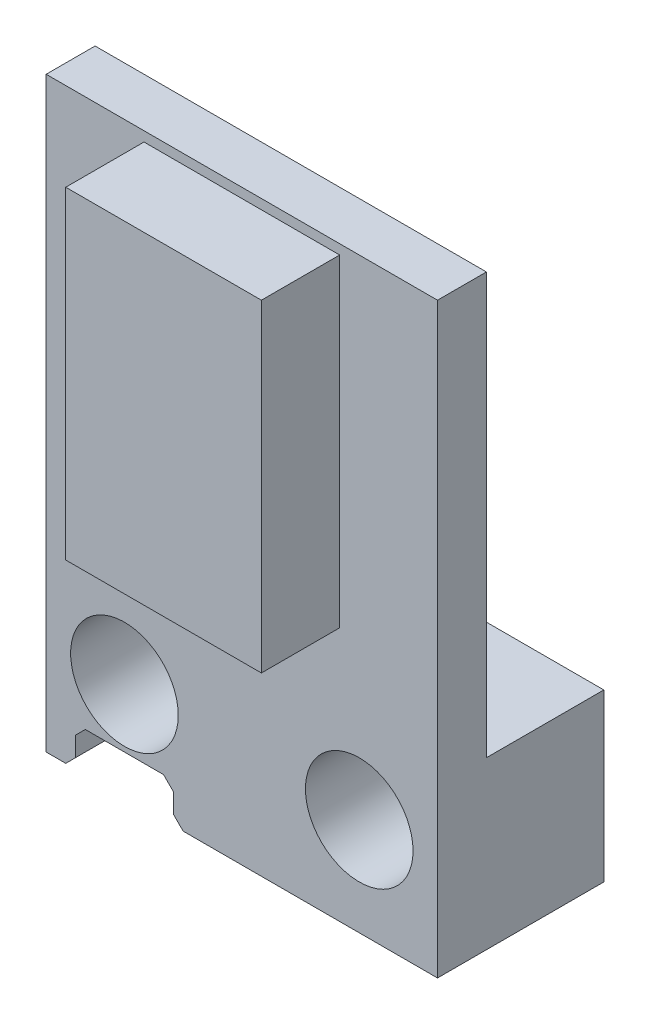
ISO-10303-21;
HEADER;
FILE_DESCRIPTION(('STEP AP214'),'2;1');
FILE_NAME('part.step','',(''),(''),'','','');
FILE_SCHEMA(('AUTOMOTIVE_DESIGN { 1 0 10303 214 1 1 1 1 }'));
ENDSEC;
DATA;
#1=APPLICATION_CONTEXT('core data for automotive mechanical design processes');
#2=APPLICATION_PROTOCOL_DEFINITION('international standard','automotive_design',2000,#1);
#3=PRODUCT_CONTEXT('',#1,'mechanical');
#4=PRODUCT('Part','Part','',(#3));
#5=PRODUCT_RELATED_PRODUCT_CATEGORY('part','',(#4));
#6=PRODUCT_DEFINITION_FORMATION('','',#4);
#7=PRODUCT_DEFINITION_CONTEXT('part definition',#1,'design');
#8=PRODUCT_DEFINITION('design','',#6,#7);
#9=PRODUCT_DEFINITION_SHAPE('','',#8);
#10=(LENGTH_UNIT() NAMED_UNIT(*) SI_UNIT(.MILLI.,.METRE.));
#11=(NAMED_UNIT(*) PLANE_ANGLE_UNIT() SI_UNIT($,.RADIAN.));
#12=(NAMED_UNIT(*) SI_UNIT($,.STERADIAN.) SOLID_ANGLE_UNIT());
#13=UNCERTAINTY_MEASURE_WITH_UNIT(LENGTH_MEASURE(1.E-05),#10,'distance_accuracy_value','');
#14=(GEOMETRIC_REPRESENTATION_CONTEXT(3) GLOBAL_UNCERTAINTY_ASSIGNED_CONTEXT((#13)) GLOBAL_UNIT_ASSIGNED_CONTEXT((#10,
#11,#12)) REPRESENTATION_CONTEXT('',''));
#15=CARTESIAN_POINT('',(0.,0.,0.));
#16=DIRECTION('',(0.,0.,1.));
#17=DIRECTION('',(1.,0.,0.));
#18=AXIS2_PLACEMENT_3D('',#15,#16,#17);
#19=CARTESIAN_POINT('',(-20.,-30.,5.));
#20=DIRECTION('',(0.,1.,0.));
#21=DIRECTION('',(0.,0.,1.));
#22=AXIS2_PLACEMENT_3D('',#19,#20,#21);
#23=PLANE('',#22);
#24=DIRECTION('',(-1.,0.,0.));
#25=VECTOR('',#24,1.);
#26=CARTESIAN_POINT('',(20.,-30.,-12.));
#27=LINE('',#26,#25);
#28=CARTESIAN_POINT('',(-18.,-30.,-12.));
#29=VERTEX_POINT('',#28);
#30=CARTESIAN_POINT('',(-20.,-30.,-12.));
#31=VERTEX_POINT('',#30);
#32=EDGE_CURVE('E286',#29,#31,#27,.T.);
#33=ORIENTED_EDGE('',*,*,#32,.F.);
#34=DIRECTION('',(0.,0.,1.));
#35=VECTOR('',#34,1.);
#36=CARTESIAN_POINT('',(-18.,-30.,5.));
#37=LINE('',#36,#35);
#38=CARTESIAN_POINT('',(-18.,-30.,5.));
#39=VERTEX_POINT('',#38);
#40=EDGE_CURVE('E342',#29,#39,#37,.T.);
#41=ORIENTED_EDGE('',*,*,#40,.T.);
#42=DIRECTION('',(1.,0.,0.));
#43=VECTOR('',#42,1.);
#44=CARTESIAN_POINT('',(-20.,-30.,5.));
#45=LINE('',#44,#43);
#46=CARTESIAN_POINT('',(-20.,-30.,5.));
#47=VERTEX_POINT('',#46);
#48=EDGE_CURVE('E311',#47,#39,#45,.T.);
#49=ORIENTED_EDGE('',*,*,#48,.F.);
#50=DIRECTION('',(0.,0.,-1.));
#51=VECTOR('',#50,1.);
#52=CARTESIAN_POINT('',(-20.,-30.,5.));
#53=LINE('',#52,#51);
#54=EDGE_CURVE('E321',#47,#31,#53,.T.);
#55=ORIENTED_EDGE('',*,*,#54,.T.);
#56=EDGE_LOOP('',(#33,#41,#49,#55));
#57=FACE_BOUND('',#56,.T.);
#58=ADVANCED_FACE('F37',(#57),#23,.F.);
#59=CARTESIAN_POINT('',(5.,-3.,10.));
#60=DIRECTION('',(0.,-1.,0.));
#61=DIRECTION('',(0.,0.,-1.));
#62=AXIS2_PLACEMENT_3D('',#59,#60,#61);
#63=PLANE('',#62);
#64=DIRECTION('',(0.,0.,-1.));
#65=VECTOR('',#64,1.);
#66=CARTESIAN_POINT('',(5.,-3.,10.));
#67=LINE('',#66,#65);
#68=CARTESIAN_POINT('',(5.,-3.,10.));
#69=VERTEX_POINT('',#68);
#70=CARTESIAN_POINT('',(5.,-3.,9.));
#71=VERTEX_POINT('',#70);
#72=EDGE_CURVE('E477',#69,#71,#67,.T.);
#73=ORIENTED_EDGE('',*,*,#72,.T.);
#74=DIRECTION('',(-1.,0.,0.));
#75=VECTOR('',#74,1.);
#76=CARTESIAN_POINT('',(5.,-3.,9.));
#77=LINE('',#76,#75);
#78=CARTESIAN_POINT('',(-5.,-3.,9.));
#79=VERTEX_POINT('',#78);
#80=EDGE_CURVE('E447',#71,#79,#77,.T.);
#81=ORIENTED_EDGE('',*,*,#80,.T.);
#82=DIRECTION('',(0.,0.,-1.));
#83=VECTOR('',#82,1.);
#84=CARTESIAN_POINT('',(-5.,-3.,10.));
#85=LINE('',#84,#83);
#86=CARTESIAN_POINT('',(-5.,-3.,10.));
#87=VERTEX_POINT('',#86);
#88=EDGE_CURVE('E473',#87,#79,#85,.T.);
#89=ORIENTED_EDGE('',*,*,#88,.F.);
#90=DIRECTION('',(-1.,0.,0.));
#91=VECTOR('',#90,1.);
#92=CARTESIAN_POINT('',(5.,-3.,10.));
#93=LINE('',#92,#91);
#94=EDGE_CURVE('E461',#69,#87,#93,.T.);
#95=ORIENTED_EDGE('',*,*,#94,.F.);
#96=EDGE_LOOP('',(#73,#81,#89,#95));
#97=FACE_BOUND('',#96,.T.);
#98=ADVANCED_FACE('F528',(#97),#63,.F.);
#99=CARTESIAN_POINT('',(0.,0.,5.));
#100=DIRECTION('',(0.,0.,-1.));
#101=DIRECTION('',(-1.,0.,0.));
#102=AXIS2_PLACEMENT_3D('',#99,#100,#101);
#103=PLANE('',#102);
#104=ORIENTED_EDGE('',*,*,#48,.T.);
#105=DIRECTION('',(-0.707106781186548,-0.707106781186548,0.));
#106=VECTOR('',#105,1.);
#107=CARTESIAN_POINT('',(-18.,-30.,5.));
#108=LINE('',#107,#106);
#109=CARTESIAN_POINT('',(-17.,-29.,5.));
#110=VERTEX_POINT('',#109);
#111=EDGE_CURVE('E347',#39,#110,#108,.F.);
#112=ORIENTED_EDGE('',*,*,#111,.T.);
#113=DIRECTION('',(0.,-1.,0.));
#114=VECTOR('',#113,1.);
#115=CARTESIAN_POINT('',(-17.,-30.,5.));
#116=LINE('',#115,#114);
#117=CARTESIAN_POINT('',(-17.,-27.,5.));
#118=VERTEX_POINT('',#117);
#119=EDGE_CURVE('E382',#118,#110,#116,.T.);
#120=ORIENTED_EDGE('',*,*,#119,.F.);
#121=DIRECTION('',(-0.707106781186545,-0.70710678118655,0.));
#122=VECTOR('',#121,1.);
#123=CARTESIAN_POINT('',(4.99999999999994,-4.99999999999991,5.));
#124=LINE('',#123,#122);
#125=CARTESIAN_POINT('',(-16.,-26.,5.));
#126=VERTEX_POINT('',#125);
#127=EDGE_CURVE('E368',#118,#126,#124,.F.);
#128=ORIENTED_EDGE('',*,*,#127,.T.);
#129=DIRECTION('',(-1.,0.,0.));
#130=VECTOR('',#129,1.);
#131=CARTESIAN_POINT('',(-17.,-26.,5.));
#132=LINE('',#131,#130);
#133=CARTESIAN_POINT('',(-8.00000000000002,-26.,5.));
#134=VERTEX_POINT('',#133);
#135=EDGE_CURVE('E377',#134,#126,#132,.T.);
#136=ORIENTED_EDGE('',*,*,#135,.F.);
#137=DIRECTION('',(-0.707106781186552,0.707106781186543,0.));
#138=VECTOR('',#137,1.);
#139=CARTESIAN_POINT('',(-17.,-17.0000000000002,5.));
#140=LINE('',#139,#138);
#141=CARTESIAN_POINT('',(-7.,-27.,5.));
#142=VERTEX_POINT('',#141);
#143=EDGE_CURVE('E46',#134,#142,#140,.F.);
#144=ORIENTED_EDGE('',*,*,#143,.T.);
#145=DIRECTION('',(0.,1.,0.));
#146=VECTOR('',#145,1.);
#147=CARTESIAN_POINT('',(-7.,-30.,5.));
#148=LINE('',#147,#146);
#149=CARTESIAN_POINT('',(-7.,-29.,5.));
#150=VERTEX_POINT('',#149);
#151=EDGE_CURVE('E375',#150,#142,#148,.T.);
#152=ORIENTED_EDGE('',*,*,#151,.F.);
#153=DIRECTION('',(-0.707106781186548,0.707106781186548,0.));
#154=VECTOR('',#153,1.);
#155=CARTESIAN_POINT('',(-7.,-29.,5.));
#156=LINE('',#155,#154);
#157=CARTESIAN_POINT('',(-5.99999999999999,-30.,5.));
#158=VERTEX_POINT('',#157);
#159=EDGE_CURVE('E345',#150,#158,#156,.F.);
#160=ORIENTED_EDGE('',*,*,#159,.T.);
#161=CARTESIAN_POINT('',(20.,-30.,5.));
#162=VERTEX_POINT('',#161);
#163=EDGE_CURVE('E310',#158,#162,#45,.T.);
#164=ORIENTED_EDGE('',*,*,#163,.T.);
#165=DIRECTION('',(0.,1.,0.));
#166=VECTOR('',#165,1.);
#167=CARTESIAN_POINT('',(20.,-30.,5.));
#168=LINE('',#167,#166);
#169=CARTESIAN_POINT('',(20.,30.,5.));
#170=VERTEX_POINT('',#169);
#171=EDGE_CURVE('E302',#162,#170,#168,.T.);
#172=ORIENTED_EDGE('',*,*,#171,.T.);
#173=DIRECTION('',(-1.,0.,0.));
#174=VECTOR('',#173,1.);
#175=CARTESIAN_POINT('',(-20.,30.,5.));
#176=LINE('',#175,#174);
#177=CARTESIAN_POINT('',(-20.,30.,5.));
#178=VERTEX_POINT('',#177);
#179=EDGE_CURVE('E305',#170,#178,#176,.T.);
#180=ORIENTED_EDGE('',*,*,#179,.T.);
#181=DIRECTION('',(0.,-1.,0.));
#182=VECTOR('',#181,1.);
#183=CARTESIAN_POINT('',(-20.,-30.,5.));
#184=LINE('',#183,#182);
#185=EDGE_CURVE('E308',#178,#47,#184,.T.);
#186=ORIENTED_EDGE('',*,*,#185,.T.);
#187=EDGE_LOOP('',(#104,#112,#120,#128,#136,#144,#152,#160,#164,#172,#180,#186));
#188=FACE_BOUND('',#187,.T.);
#189=CARTESIAN_POINT('',(12.,-20.,5.));
#190=DIRECTION('',(0.,0.,1.));
#191=DIRECTION('',(1.,0.,0.));
#192=AXIS2_PLACEMENT_3D('',#189,#190,#191);
#193=CIRCLE('',#192,5.5);
#194=CARTESIAN_POINT('',(17.5,-20.,5.));
#195=VERTEX_POINT('',#194);
#196=EDGE_CURVE('E279',#195,#195,#193,.T.);
#197=ORIENTED_EDGE('',*,*,#196,.F.);
#198=EDGE_LOOP('',(#197));
#199=FACE_BOUND('',#198,.T.);
#200=CARTESIAN_POINT('',(-12.,-20.,5.));
#201=DIRECTION('',(0.,0.,1.));
#202=DIRECTION('',(1.,0.,0.));
#203=AXIS2_PLACEMENT_3D('',#200,#201,#202);
#204=CIRCLE('',#203,5.5);
#205=CARTESIAN_POINT('',(-6.5,-20.,5.));
#206=VERTEX_POINT('',#205);
#207=EDGE_CURVE('E273',#206,#206,#204,.T.);
#208=ORIENTED_EDGE('',*,*,#207,.F.);
#209=EDGE_LOOP('',(#208));
#210=FACE_BOUND('',#209,.T.);
#211=DIRECTION('',(0.,1.,0.));
#212=VECTOR('',#211,1.);
#213=CARTESIAN_POINT('',(10.,-4.,5.));
#214=LINE('',#213,#212);
#215=CARTESIAN_POINT('',(10.,-4.,5.));
#216=VERTEX_POINT('',#215);
#217=CARTESIAN_POINT('',(10.,29.,5.));
#218=VERTEX_POINT('',#217);
#219=EDGE_CURVE('E239',#216,#218,#214,.T.);
#220=ORIENTED_EDGE('',*,*,#219,.F.);
#221=DIRECTION('',(1.,0.,0.));
#222=VECTOR('',#221,1.);
#223=CARTESIAN_POINT('',(-10.,-4.,5.));
#224=LINE('',#223,#222);
#225=CARTESIAN_POINT('',(5.,-4.,5.));
#226=VERTEX_POINT('',#225);
#227=EDGE_CURVE('E230',#226,#216,#224,.T.);
#228=ORIENTED_EDGE('',*,*,#227,.F.);
#229=DIRECTION('',(0.,-1.,0.));
#230=VECTOR('',#229,1.);
#231=CARTESIAN_POINT('',(5.,6.,5.));
#232=LINE('',#231,#230);
#233=CARTESIAN_POINT('',(5.,-3.,5.));
#234=VERTEX_POINT('',#233);
#235=EDGE_CURVE('E212',#234,#226,#232,.T.);
#236=ORIENTED_EDGE('',*,*,#235,.F.);
#237=DIRECTION('',(1.,0.,0.));
#238=VECTOR('',#237,1.);
#239=CARTESIAN_POINT('',(5.,-3.,5.));
#240=LINE('',#239,#238);
#241=CARTESIAN_POINT('',(-5.,-3.,5.));
#242=VERTEX_POINT('',#241);
#243=EDGE_CURVE('E442',#242,#234,#240,.T.);
#244=ORIENTED_EDGE('',*,*,#243,.F.);
#245=DIRECTION('',(0.,-1.,0.));
#246=VECTOR('',#245,1.);
#247=CARTESIAN_POINT('',(-5.,6.,5.));
#248=LINE('',#247,#246);
#249=CARTESIAN_POINT('',(-5.,-4.,5.));
#250=VERTEX_POINT('',#249);
#251=EDGE_CURVE('E224',#242,#250,#248,.T.);
#252=ORIENTED_EDGE('',*,*,#251,.T.);
#253=CARTESIAN_POINT('',(-10.,-4.,5.));
#254=VERTEX_POINT('',#253);
#255=EDGE_CURVE('E241',#254,#250,#224,.T.);
#256=ORIENTED_EDGE('',*,*,#255,.F.);
#257=DIRECTION('',(0.,-1.,0.));
#258=VECTOR('',#257,1.);
#259=CARTESIAN_POINT('',(-10.,-4.,5.));
#260=LINE('',#259,#258);
#261=CARTESIAN_POINT('',(-10.,29.,5.));
#262=VERTEX_POINT('',#261);
#263=EDGE_CURVE('E242',#262,#254,#260,.T.);
#264=ORIENTED_EDGE('',*,*,#263,.F.);
#265=DIRECTION('',(-1.,0.,0.));
#266=VECTOR('',#265,1.);
#267=CARTESIAN_POINT('',(-10.,29.,5.));
#268=LINE('',#267,#266);
#269=EDGE_CURVE('E246',#218,#262,#268,.T.);
#270=ORIENTED_EDGE('',*,*,#269,.F.);
#271=EDGE_LOOP('',(#220,#228,#236,#244,#252,#256,#264,#270));
#272=FACE_BOUND('',#271,.T.);
#273=ADVANCED_FACE('F237',(#188,#199,#210,#272),#103,.F.);
#274=CARTESIAN_POINT('',(20.,-30.,5.));
#275=DIRECTION('',(-1.,0.,0.));
#276=DIRECTION('',(0.,0.,1.));
#277=AXIS2_PLACEMENT_3D('',#274,#275,#276);
#278=PLANE('',#277);
#279=DIRECTION('',(0.,0.,-1.));
#280=VECTOR('',#279,1.);
#281=CARTESIAN_POINT('',(20.,-30.,5.));
#282=LINE('',#281,#280);
#283=CARTESIAN_POINT('',(20.,-30.,-12.));
#284=VERTEX_POINT('',#283);
#285=EDGE_CURVE('E314',#162,#284,#282,.T.);
#286=ORIENTED_EDGE('',*,*,#285,.T.);
#287=DIRECTION('',(0.,-1.,0.));
#288=VECTOR('',#287,1.);
#289=CARTESIAN_POINT('',(20.,-30.,-12.));
#290=LINE('',#289,#288);
#291=CARTESIAN_POINT('',(20.,-13.,-12.));
#292=VERTEX_POINT('',#291);
#293=EDGE_CURVE('E283',#292,#284,#290,.T.);
#294=ORIENTED_EDGE('',*,*,#293,.F.);
#295=DIRECTION('',(0.,0.,1.));
#296=VECTOR('',#295,1.);
#297=CARTESIAN_POINT('',(20.,-13.,-12.));
#298=LINE('',#297,#296);
#299=CARTESIAN_POINT('',(20.,-13.,0.));
#300=VERTEX_POINT('',#299);
#301=EDGE_CURVE('E293',#292,#300,#298,.T.);
#302=ORIENTED_EDGE('',*,*,#301,.T.);
#303=DIRECTION('',(0.,1.,0.));
#304=VECTOR('',#303,1.);
#305=CARTESIAN_POINT('',(20.,-30.,0.));
#306=LINE('',#305,#304);
#307=CARTESIAN_POINT('',(20.,30.,0.));
#308=VERTEX_POINT('',#307);
#309=EDGE_CURVE('E301',#300,#308,#306,.T.);
#310=ORIENTED_EDGE('',*,*,#309,.T.);
#311=DIRECTION('',(0.,0.,-1.));
#312=VECTOR('',#311,1.);
#313=CARTESIAN_POINT('',(20.,30.,5.));
#314=LINE('',#313,#312);
#315=EDGE_CURVE('E327',#170,#308,#314,.T.);
#316=ORIENTED_EDGE('',*,*,#315,.F.);
#317=ORIENTED_EDGE('',*,*,#171,.F.);
#318=EDGE_LOOP('',(#286,#294,#302,#310,#316,#317));
#319=FACE_BOUND('',#318,.T.);
#320=ADVANCED_FACE('F419',(#319),#278,.F.);
#321=CARTESIAN_POINT('',(-20.,30.,5.));
#322=DIRECTION('',(0.,-1.,0.));
#323=DIRECTION('',(0.,0.,-1.));
#324=AXIS2_PLACEMENT_3D('',#321,#322,#323);
#325=PLANE('',#324);
#326=DIRECTION('',(-1.,0.,0.));
#327=VECTOR('',#326,1.);
#328=CARTESIAN_POINT('',(-20.,30.,0.));
#329=LINE('',#328,#327);
#330=CARTESIAN_POINT('',(-20.,30.,0.));
#331=VERTEX_POINT('',#330);
#332=EDGE_CURVE('E316',#308,#331,#329,.T.);
#333=ORIENTED_EDGE('',*,*,#332,.T.);
#334=DIRECTION('',(0.,0.,-1.));
#335=VECTOR('',#334,1.);
#336=CARTESIAN_POINT('',(-20.,30.,5.));
#337=LINE('',#336,#335);
#338=EDGE_CURVE('E324',#178,#331,#337,.T.);
#339=ORIENTED_EDGE('',*,*,#338,.F.);
#340=ORIENTED_EDGE('',*,*,#179,.F.);
#341=ORIENTED_EDGE('',*,*,#315,.T.);
#342=EDGE_LOOP('',(#333,#339,#340,#341));
#343=FACE_BOUND('',#342,.T.);
#344=ADVANCED_FACE('F433',(#343),#325,.F.);
#345=CARTESIAN_POINT('',(-20.,-30.,5.));
#346=DIRECTION('',(1.,0.,0.));
#347=DIRECTION('',(0.,0.,-1.));
#348=AXIS2_PLACEMENT_3D('',#345,#346,#347);
#349=PLANE('',#348);
#350=DIRECTION('',(0.,-1.,0.));
#351=VECTOR('',#350,1.);
#352=CARTESIAN_POINT('',(-20.,-30.,0.));
#353=LINE('',#352,#351);
#354=CARTESIAN_POINT('',(-20.,-13.,0.));
#355=VERTEX_POINT('',#354);
#356=EDGE_CURVE('E306',#331,#355,#353,.T.);
#357=ORIENTED_EDGE('',*,*,#356,.T.);
#358=DIRECTION('',(0.,0.,1.));
#359=VECTOR('',#358,1.);
#360=CARTESIAN_POINT('',(-20.,-13.,-12.));
#361=LINE('',#360,#359);
#362=CARTESIAN_POINT('',(-20.,-13.,-12.));
#363=VERTEX_POINT('',#362);
#364=EDGE_CURVE('E298',#363,#355,#361,.T.);
#365=ORIENTED_EDGE('',*,*,#364,.F.);
#366=DIRECTION('',(0.,1.,0.));
#367=VECTOR('',#366,1.);
#368=CARTESIAN_POINT('',(-20.,-30.,-12.));
#369=LINE('',#368,#367);
#370=EDGE_CURVE('E289',#31,#363,#369,.T.);
#371=ORIENTED_EDGE('',*,*,#370,.F.);
#372=ORIENTED_EDGE('',*,*,#54,.F.);
#373=ORIENTED_EDGE('',*,*,#185,.F.);
#374=ORIENTED_EDGE('',*,*,#338,.T.);
#375=EDGE_LOOP('',(#357,#365,#371,#372,#373,#374));
#376=FACE_BOUND('',#375,.T.);
#377=ADVANCED_FACE('F412',(#376),#349,.F.);
#378=ORIENTED_EDGE('',*,*,#163,.F.);
#379=DIRECTION('',(0.,0.,-1.));
#380=VECTOR('',#379,1.);
#381=CARTESIAN_POINT('',(-5.99999999999999,-30.,5.));
#382=LINE('',#381,#380);
#383=CARTESIAN_POINT('',(-5.99999999999999,-30.,-12.));
#384=VERTEX_POINT('',#383);
#385=EDGE_CURVE('E366',#158,#384,#382,.T.);
#386=ORIENTED_EDGE('',*,*,#385,.T.);
#387=EDGE_CURVE('E287',#284,#384,#27,.T.);
#388=ORIENTED_EDGE('',*,*,#387,.F.);
#389=ORIENTED_EDGE('',*,*,#285,.F.);
#390=EDGE_LOOP('',(#378,#386,#388,#389));
#391=FACE_BOUND('',#390,.T.);
#392=ADVANCED_FACE('F426',(#391),#23,.F.);
#393=CARTESIAN_POINT('',(0.,0.,0.));
#394=DIRECTION('',(0.,0.,-1.));
#395=DIRECTION('',(-1.,0.,0.));
#396=AXIS2_PLACEMENT_3D('',#393,#394,#395);
#397=PLANE('',#396);
#398=DIRECTION('',(0.,1.,0.));
#399=VECTOR('',#398,1.);
#400=CARTESIAN_POINT('',(-5.,-3.,0.));
#401=LINE('',#400,#399);
#402=CARTESIAN_POINT('',(-5.,-3.,0.));
#403=VERTEX_POINT('',#402);
#404=CARTESIAN_POINT('',(-5.,27.,0.));
#405=VERTEX_POINT('',#404);
#406=EDGE_CURVE('E450',#403,#405,#401,.T.);
#407=ORIENTED_EDGE('',*,*,#406,.F.);
#408=DIRECTION('',(-1.,0.,0.));
#409=VECTOR('',#408,1.);
#410=CARTESIAN_POINT('',(5.,-3.,0.));
#411=LINE('',#410,#409);
#412=CARTESIAN_POINT('',(5.,-3.,0.));
#413=VERTEX_POINT('',#412);
#414=EDGE_CURVE('E455',#413,#403,#411,.T.);
#415=ORIENTED_EDGE('',*,*,#414,.F.);
#416=DIRECTION('',(0.,-1.,0.));
#417=VECTOR('',#416,1.);
#418=CARTESIAN_POINT('',(5.,-3.,0.));
#419=LINE('',#418,#417);
#420=CARTESIAN_POINT('',(5.,27.,0.));
#421=VERTEX_POINT('',#420);
#422=EDGE_CURVE('E469',#421,#413,#419,.T.);
#423=ORIENTED_EDGE('',*,*,#422,.F.);
#424=DIRECTION('',(1.,0.,0.));
#425=VECTOR('',#424,1.);
#426=CARTESIAN_POINT('',(5.,27.,0.));
#427=LINE('',#426,#425);
#428=EDGE_CURVE('E466',#405,#421,#427,.T.);
#429=ORIENTED_EDGE('',*,*,#428,.F.);
#430=EDGE_LOOP('',(#407,#415,#423,#429));
#431=FACE_BOUND('',#430,.T.);
#432=DIRECTION('',(1.,0.,0.));
#433=VECTOR('',#432,1.);
#434=CARTESIAN_POINT('',(20.,-13.,0.));
#435=LINE('',#434,#433);
#436=EDGE_CURVE('E272',#355,#300,#435,.T.);
#437=ORIENTED_EDGE('',*,*,#436,.F.);
#438=ORIENTED_EDGE('',*,*,#356,.F.);
#439=ORIENTED_EDGE('',*,*,#332,.F.);
#440=ORIENTED_EDGE('',*,*,#309,.F.);
#441=EDGE_LOOP('',(#437,#438,#439,#440));
#442=FACE_BOUND('',#441,.T.);
#443=ADVANCED_FACE('F517',(#431,#442),#397,.T.);
#444=CARTESIAN_POINT('',(20.,-13.,-12.));
#445=DIRECTION('',(0.,-1.,0.));
#446=DIRECTION('',(0.,0.,-1.));
#447=AXIS2_PLACEMENT_3D('',#444,#445,#446);
#448=PLANE('',#447);
#449=ORIENTED_EDGE('',*,*,#436,.T.);
#450=ORIENTED_EDGE('',*,*,#301,.F.);
#451=DIRECTION('',(1.,0.,0.));
#452=VECTOR('',#451,1.);
#453=CARTESIAN_POINT('',(20.,-13.,-12.));
#454=LINE('',#453,#452);
#455=EDGE_CURVE('E291',#363,#292,#454,.T.);
#456=ORIENTED_EDGE('',*,*,#455,.F.);
#457=ORIENTED_EDGE('',*,*,#364,.T.);
#458=EDGE_LOOP('',(#449,#450,#456,#457));
#459=FACE_BOUND('',#458,.T.);
#460=ADVANCED_FACE('F417',(#459),#448,.F.);
#461=CARTESIAN_POINT('',(0.,0.,-12.));
#462=DIRECTION('',(0.,0.,1.));
#463=DIRECTION('',(1.,0.,0.));
#464=AXIS2_PLACEMENT_3D('',#461,#462,#463);
#465=PLANE('',#464);
#466=CARTESIAN_POINT('',(-12.,-20.,-12.));
#467=DIRECTION('',(0.,0.,1.));
#468=DIRECTION('',(1.,0.,0.));
#469=AXIS2_PLACEMENT_3D('',#466,#467,#468);
#470=CIRCLE('',#469,3.);
#471=CARTESIAN_POINT('',(-9.,-20.,-12.));
#472=VERTEX_POINT('',#471);
#473=EDGE_CURVE('E282',#472,#472,#470,.T.);
#474=ORIENTED_EDGE('',*,*,#473,.T.);
#475=EDGE_LOOP('',(#474));
#476=FACE_BOUND('',#475,.T.);
#477=CARTESIAN_POINT('',(12.,-20.,-12.));
#478=DIRECTION('',(0.,0.,1.));
#479=DIRECTION('',(1.,0.,0.));
#480=AXIS2_PLACEMENT_3D('',#477,#478,#479);
#481=CIRCLE('',#480,3.);
#482=CARTESIAN_POINT('',(15.,-20.,-12.));
#483=VERTEX_POINT('',#482);
#484=EDGE_CURVE('E266',#483,#483,#481,.T.);
#485=ORIENTED_EDGE('',*,*,#484,.T.);
#486=EDGE_LOOP('',(#485));
#487=FACE_BOUND('',#486,.T.);
#488=DIRECTION('',(0.,-1.,0.));
#489=VECTOR('',#488,1.);
#490=CARTESIAN_POINT('',(-17.,0.,-12.));
#491=LINE('',#490,#489);
#492=CARTESIAN_POINT('',(-17.,-27.,-12.));
#493=VERTEX_POINT('',#492);
#494=CARTESIAN_POINT('',(-17.,-29.,-12.));
#495=VERTEX_POINT('',#494);
#496=EDGE_CURVE('E339',#493,#495,#491,.T.);
#497=ORIENTED_EDGE('',*,*,#496,.T.);
#498=DIRECTION('',(0.707106781186548,0.707106781186548,0.));
#499=VECTOR('',#498,1.);
#500=CARTESIAN_POINT('',(-18.,-30.,-12.));
#501=LINE('',#500,#499);
#502=EDGE_CURVE('E355',#495,#29,#501,.F.);
#503=ORIENTED_EDGE('',*,*,#502,.T.);
#504=ORIENTED_EDGE('',*,*,#32,.T.);
#505=ORIENTED_EDGE('',*,*,#370,.T.);
#506=ORIENTED_EDGE('',*,*,#455,.T.);
#507=ORIENTED_EDGE('',*,*,#293,.T.);
#508=ORIENTED_EDGE('',*,*,#387,.T.);
#509=DIRECTION('',(0.707106781186548,-0.707106781186548,0.));
#510=VECTOR('',#509,1.);
#511=CARTESIAN_POINT('',(-7.,-29.,-12.));
#512=LINE('',#511,#510);
#513=CARTESIAN_POINT('',(-7.,-29.,-12.));
#514=VERTEX_POINT('',#513);
#515=EDGE_CURVE('E60',#384,#514,#512,.F.);
#516=ORIENTED_EDGE('',*,*,#515,.T.);
#517=DIRECTION('',(0.,1.,0.));
#518=VECTOR('',#517,1.);
#519=CARTESIAN_POINT('',(-7.,0.,-12.));
#520=LINE('',#519,#518);
#521=CARTESIAN_POINT('',(-7.,-27.,-12.));
#522=VERTEX_POINT('',#521);
#523=EDGE_CURVE('E330',#514,#522,#520,.T.);
#524=ORIENTED_EDGE('',*,*,#523,.T.);
#525=DIRECTION('',(0.707106781186552,-0.707106781186543,0.));
#526=VECTOR('',#525,1.);
#527=CARTESIAN_POINT('',(-17.,-17.0000000000002,-12.));
#528=LINE('',#527,#526);
#529=CARTESIAN_POINT('',(-8.00000000000002,-26.,-12.));
#530=VERTEX_POINT('',#529);
#531=EDGE_CURVE('E11',#522,#530,#528,.F.);
#532=ORIENTED_EDGE('',*,*,#531,.T.);
#533=DIRECTION('',(-1.,0.,0.));
#534=VECTOR('',#533,1.);
#535=CARTESIAN_POINT('',(0.,-26.,-12.));
#536=LINE('',#535,#534);
#537=CARTESIAN_POINT('',(-16.,-26.,-12.));
#538=VERTEX_POINT('',#537);
#539=EDGE_CURVE('E336',#530,#538,#536,.T.);
#540=ORIENTED_EDGE('',*,*,#539,.T.);
#541=DIRECTION('',(0.707106781186545,0.70710678118655,0.));
#542=VECTOR('',#541,1.);
#543=CARTESIAN_POINT('',(4.99999999999994,-4.99999999999991,-12.));
#544=LINE('',#543,#542);
#545=EDGE_CURVE('E370',#538,#493,#544,.F.);
#546=ORIENTED_EDGE('',*,*,#545,.T.);
#547=EDGE_LOOP('',(#497,#503,#504,#505,#506,#507,#508,#516,#524,#532,#540,#546));
#548=FACE_BOUND('',#547,.T.);
#549=ADVANCED_FACE('F386',(#476,#487,#548),#465,.F.);
#550=CARTESIAN_POINT('',(12.,-20.,-10.));
#551=DIRECTION('',(0.,0.,1.));
#552=DIRECTION('',(1.,0.,0.));
#553=AXIS2_PLACEMENT_3D('',#550,#551,#552);
#554=CYLINDRICAL_SURFACE('',#553,5.5);
#555=CARTESIAN_POINT('',(12.,-20.,-10.));
#556=DIRECTION('',(0.,0.,1.));
#557=DIRECTION('',(1.,0.,0.));
#558=AXIS2_PLACEMENT_3D('',#555,#556,#557);
#559=CIRCLE('',#558,5.5);
#560=CARTESIAN_POINT('',(17.5,-20.,-10.));
#561=VERTEX_POINT('',#560);
#562=EDGE_CURVE('E276',#561,#561,#559,.T.);
#563=ORIENTED_EDGE('',*,*,#562,.F.);
#564=EDGE_LOOP('',(#563));
#565=FACE_BOUND('',#564,.T.);
#566=ORIENTED_EDGE('',*,*,#196,.T.);
#567=EDGE_LOOP('',(#566));
#568=FACE_BOUND('',#567,.T.);
#569=ADVANCED_FACE('F624',(#565,#568),#554,.F.);
#570=CARTESIAN_POINT('',(12.,-20.,-10.));
#571=DIRECTION('',(0.,0.,1.));
#572=DIRECTION('',(1.,0.,0.));
#573=AXIS2_PLACEMENT_3D('',#570,#571,#572);
#574=PLANE('',#573);
#575=CARTESIAN_POINT('',(12.,-20.,-10.));
#576=DIRECTION('',(0.,0.,1.));
#577=DIRECTION('',(1.,0.,0.));
#578=AXIS2_PLACEMENT_3D('',#575,#576,#577);
#579=CIRCLE('',#578,3.);
#580=CARTESIAN_POINT('',(15.,-20.,-10.));
#581=VERTEX_POINT('',#580);
#582=EDGE_CURVE('E262',#581,#581,#579,.T.);
#583=ORIENTED_EDGE('',*,*,#582,.F.);
#584=EDGE_LOOP('',(#583));
#585=FACE_BOUND('',#584,.T.);
#586=ORIENTED_EDGE('',*,*,#562,.T.);
#587=EDGE_LOOP('',(#586));
#588=FACE_BOUND('',#587,.T.);
#589=ADVANCED_FACE('F783',(#585,#588),#574,.T.);
#590=CARTESIAN_POINT('',(-12.,-20.,-10.));
#591=DIRECTION('',(0.,0.,1.));
#592=DIRECTION('',(1.,0.,0.));
#593=AXIS2_PLACEMENT_3D('',#590,#591,#592);
#594=CYLINDRICAL_SURFACE('',#593,5.5);
#595=CARTESIAN_POINT('',(-12.,-20.,-10.));
#596=DIRECTION('',(0.,0.,1.));
#597=DIRECTION('',(1.,0.,0.));
#598=AXIS2_PLACEMENT_3D('',#595,#596,#597);
#599=CIRCLE('',#598,5.5);
#600=CARTESIAN_POINT('',(-6.5,-20.,-10.));
#601=VERTEX_POINT('',#600);
#602=EDGE_CURVE('E269',#601,#601,#599,.T.);
#603=ORIENTED_EDGE('',*,*,#602,.F.);
#604=EDGE_LOOP('',(#603));
#605=FACE_BOUND('',#604,.T.);
#606=ORIENTED_EDGE('',*,*,#207,.T.);
#607=EDGE_LOOP('',(#606));
#608=FACE_BOUND('',#607,.T.);
#609=ADVANCED_FACE('F775',(#605,#608),#594,.F.);
#610=CARTESIAN_POINT('',(-12.,-20.,-10.));
#611=DIRECTION('',(0.,0.,1.));
#612=DIRECTION('',(1.,0.,0.));
#613=AXIS2_PLACEMENT_3D('',#610,#611,#612);
#614=PLANE('',#613);
#615=CARTESIAN_POINT('',(-12.,-20.,-10.));
#616=DIRECTION('',(0.,0.,1.));
#617=DIRECTION('',(1.,0.,0.));
#618=AXIS2_PLACEMENT_3D('',#615,#616,#617);
#619=CIRCLE('',#618,3.);
#620=CARTESIAN_POINT('',(-9.,-20.,-10.));
#621=VERTEX_POINT('',#620);
#622=EDGE_CURVE('E263',#621,#621,#619,.T.);
#623=ORIENTED_EDGE('',*,*,#622,.F.);
#624=EDGE_LOOP('',(#623));
#625=FACE_BOUND('',#624,.T.);
#626=ORIENTED_EDGE('',*,*,#602,.T.);
#627=EDGE_LOOP('',(#626));
#628=FACE_BOUND('',#627,.T.);
#629=ADVANCED_FACE('F765',(#625,#628),#614,.T.);
#630=CARTESIAN_POINT('',(12.,-20.,-20.));
#631=DIRECTION('',(0.,0.,1.));
#632=DIRECTION('',(1.,0.,0.));
#633=AXIS2_PLACEMENT_3D('',#630,#631,#632);
#634=CYLINDRICAL_SURFACE('',#633,3.);
#635=ORIENTED_EDGE('',*,*,#582,.T.);
#636=EDGE_LOOP('',(#635));
#637=FACE_BOUND('',#636,.T.);
#638=ORIENTED_EDGE('',*,*,#484,.F.);
#639=EDGE_LOOP('',(#638));
#640=FACE_BOUND('',#639,.T.);
#641=ADVANCED_FACE('F755',(#637,#640),#634,.F.);
#642=CARTESIAN_POINT('',(-12.,-20.,-20.));
#643=DIRECTION('',(0.,0.,1.));
#644=DIRECTION('',(1.,0.,0.));
#645=AXIS2_PLACEMENT_3D('',#642,#643,#644);
#646=CYLINDRICAL_SURFACE('',#645,3.);
#647=ORIENTED_EDGE('',*,*,#622,.T.);
#648=EDGE_LOOP('',(#647));
#649=FACE_BOUND('',#648,.T.);
#650=ORIENTED_EDGE('',*,*,#473,.F.);
#651=EDGE_LOOP('',(#650));
#652=FACE_BOUND('',#651,.T.);
#653=ADVANCED_FACE('F746',(#649,#652),#646,.F.);
#654=CARTESIAN_POINT('',(10.,-4.,13.));
#655=DIRECTION('',(-1.,0.,0.));
#656=DIRECTION('',(0.,0.,1.));
#657=AXIS2_PLACEMENT_3D('',#654,#655,#656);
#658=PLANE('',#657);
#659=ORIENTED_EDGE('',*,*,#219,.T.);
#660=DIRECTION('',(0.,0.,-1.));
#661=VECTOR('',#660,1.);
#662=CARTESIAN_POINT('',(10.,29.,13.));
#663=LINE('',#662,#661);
#664=CARTESIAN_POINT('',(10.,29.,13.));
#665=VERTEX_POINT('',#664);
#666=EDGE_CURVE('E259',#665,#218,#663,.T.);
#667=ORIENTED_EDGE('',*,*,#666,.F.);
#668=DIRECTION('',(0.,1.,0.));
#669=VECTOR('',#668,1.);
#670=CARTESIAN_POINT('',(10.,-4.,13.));
#671=LINE('',#670,#669);
#672=CARTESIAN_POINT('',(10.,-4.,13.));
#673=VERTEX_POINT('',#672);
#674=EDGE_CURVE('E244',#673,#665,#671,.T.);
#675=ORIENTED_EDGE('',*,*,#674,.F.);
#676=DIRECTION('',(0.,0.,-1.));
#677=VECTOR('',#676,1.);
#678=CARTESIAN_POINT('',(10.,-4.,13.));
#679=LINE('',#678,#677);
#680=EDGE_CURVE('E250',#673,#216,#679,.T.);
#681=ORIENTED_EDGE('',*,*,#680,.T.);
#682=EDGE_LOOP('',(#659,#667,#675,#681));
#683=FACE_BOUND('',#682,.T.);
#684=ADVANCED_FACE('F505',(#683),#658,.F.);
#685=CARTESIAN_POINT('',(-10.,29.,13.));
#686=DIRECTION('',(0.,-1.,0.));
#687=DIRECTION('',(0.,0.,-1.));
#688=AXIS2_PLACEMENT_3D('',#685,#686,#687);
#689=PLANE('',#688);
#690=ORIENTED_EDGE('',*,*,#269,.T.);
#691=DIRECTION('',(0.,0.,-1.));
#692=VECTOR('',#691,1.);
#693=CARTESIAN_POINT('',(-10.,29.,13.));
#694=LINE('',#693,#692);
#695=CARTESIAN_POINT('',(-10.,29.,13.));
#696=VERTEX_POINT('',#695);
#697=EDGE_CURVE('E256',#696,#262,#694,.T.);
#698=ORIENTED_EDGE('',*,*,#697,.F.);
#699=DIRECTION('',(-1.,0.,0.));
#700=VECTOR('',#699,1.);
#701=CARTESIAN_POINT('',(-10.,29.,13.));
#702=LINE('',#701,#700);
#703=EDGE_CURVE('E486',#665,#696,#702,.T.);
#704=ORIENTED_EDGE('',*,*,#703,.F.);
#705=ORIENTED_EDGE('',*,*,#666,.T.);
#706=EDGE_LOOP('',(#690,#698,#704,#705));
#707=FACE_BOUND('',#706,.T.);
#708=ADVANCED_FACE('F494',(#707),#689,.F.);
#709=CARTESIAN_POINT('',(-10.,-4.,13.));
#710=DIRECTION('',(1.,0.,0.));
#711=DIRECTION('',(0.,0.,-1.));
#712=AXIS2_PLACEMENT_3D('',#709,#710,#711);
#713=PLANE('',#712);
#714=ORIENTED_EDGE('',*,*,#263,.T.);
#715=DIRECTION('',(0.,0.,-1.));
#716=VECTOR('',#715,1.);
#717=CARTESIAN_POINT('',(-10.,-4.,13.));
#718=LINE('',#717,#716);
#719=CARTESIAN_POINT('',(-10.,-4.,13.));
#720=VERTEX_POINT('',#719);
#721=EDGE_CURVE('E252',#720,#254,#718,.T.);
#722=ORIENTED_EDGE('',*,*,#721,.F.);
#723=DIRECTION('',(0.,-1.,0.));
#724=VECTOR('',#723,1.);
#725=CARTESIAN_POINT('',(-10.,-4.,13.));
#726=LINE('',#725,#724);
#727=EDGE_CURVE('E488',#696,#720,#726,.T.);
#728=ORIENTED_EDGE('',*,*,#727,.F.);
#729=ORIENTED_EDGE('',*,*,#697,.T.);
#730=EDGE_LOOP('',(#714,#722,#728,#729));
#731=FACE_BOUND('',#730,.T.);
#732=ADVANCED_FACE('F498',(#731),#713,.F.);
#733=CARTESIAN_POINT('',(-10.,-4.,13.));
#734=DIRECTION('',(0.,1.,0.));
#735=DIRECTION('',(0.,0.,1.));
#736=AXIS2_PLACEMENT_3D('',#733,#734,#735);
#737=PLANE('',#736);
#738=ORIENTED_EDGE('',*,*,#255,.T.);
#739=DIRECTION('',(0.,0.,-1.));
#740=VECTOR('',#739,1.);
#741=CARTESIAN_POINT('',(-5.,-4.,5.));
#742=LINE('',#741,#740);
#743=CARTESIAN_POINT('',(-5.,-4.,9.));
#744=VERTEX_POINT('',#743);
#745=EDGE_CURVE('E235',#744,#250,#742,.T.);
#746=ORIENTED_EDGE('',*,*,#745,.F.);
#747=DIRECTION('',(-1.,0.,0.));
#748=VECTOR('',#747,1.);
#749=CARTESIAN_POINT('',(-5.,-4.,9.));
#750=LINE('',#749,#748);
#751=CARTESIAN_POINT('',(5.,-4.,9.));
#752=VERTEX_POINT('',#751);
#753=EDGE_CURVE('E234',#752,#744,#750,.T.);
#754=ORIENTED_EDGE('',*,*,#753,.F.);
#755=DIRECTION('',(0.,0.,1.));
#756=VECTOR('',#755,1.);
#757=CARTESIAN_POINT('',(5.,-4.,5.));
#758=LINE('',#757,#756);
#759=EDGE_CURVE('E216',#226,#752,#758,.T.);
#760=ORIENTED_EDGE('',*,*,#759,.F.);
#761=ORIENTED_EDGE('',*,*,#227,.T.);
#762=ORIENTED_EDGE('',*,*,#680,.F.);
#763=DIRECTION('',(1.,0.,0.));
#764=VECTOR('',#763,1.);
#765=CARTESIAN_POINT('',(-10.,-4.,13.));
#766=LINE('',#765,#764);
#767=EDGE_CURVE('E253',#720,#673,#766,.T.);
#768=ORIENTED_EDGE('',*,*,#767,.F.);
#769=ORIENTED_EDGE('',*,*,#721,.T.);
#770=EDGE_LOOP('',(#738,#746,#754,#760,#761,#762,#768,#769));
#771=FACE_BOUND('',#770,.T.);
#772=ADVANCED_FACE('F228',(#771),#737,.F.);
#773=CARTESIAN_POINT('',(0.,0.,13.));
#774=DIRECTION('',(0.,0.,-1.));
#775=DIRECTION('',(-1.,0.,0.));
#776=AXIS2_PLACEMENT_3D('',#773,#774,#775);
#777=PLANE('',#776);
#778=ORIENTED_EDGE('',*,*,#674,.T.);
#779=ORIENTED_EDGE('',*,*,#703,.T.);
#780=ORIENTED_EDGE('',*,*,#727,.T.);
#781=ORIENTED_EDGE('',*,*,#767,.T.);
#782=EDGE_LOOP('',(#778,#779,#780,#781));
#783=FACE_BOUND('',#782,.T.);
#784=ADVANCED_FACE('F502',(#783),#777,.F.);
#785=CARTESIAN_POINT('',(-5.,-3.,10.));
#786=DIRECTION('',(-1.,0.,0.));
#787=DIRECTION('',(0.,0.,1.));
#788=AXIS2_PLACEMENT_3D('',#785,#786,#787);
#789=PLANE('',#788);
#790=ORIENTED_EDGE('',*,*,#251,.F.);
#791=EDGE_CURVE('E476',#242,#403,#85,.T.);
#792=ORIENTED_EDGE('',*,*,#791,.T.);
#793=ORIENTED_EDGE('',*,*,#406,.T.);
#794=DIRECTION('',(0.,0.,-1.));
#795=VECTOR('',#794,1.);
#796=CARTESIAN_POINT('',(-5.,27.,10.));
#797=LINE('',#796,#795);
#798=CARTESIAN_POINT('',(-5.,27.,10.));
#799=VERTEX_POINT('',#798);
#800=EDGE_CURVE('E464',#799,#405,#797,.T.);
#801=ORIENTED_EDGE('',*,*,#800,.F.);
#802=DIRECTION('',(0.,1.,0.));
#803=VECTOR('',#802,1.);
#804=CARTESIAN_POINT('',(-5.,-3.,10.));
#805=LINE('',#804,#803);
#806=EDGE_CURVE('E451',#87,#799,#805,.T.);
#807=ORIENTED_EDGE('',*,*,#806,.F.);
#808=ORIENTED_EDGE('',*,*,#88,.T.);
#809=DIRECTION('',(0.,-1.,0.));
#810=VECTOR('',#809,1.);
#811=CARTESIAN_POINT('',(-5.,6.,9.));
#812=LINE('',#811,#810);
#813=EDGE_CURVE('E440',#79,#744,#812,.T.);
#814=ORIENTED_EDGE('',*,*,#813,.T.);
#815=ORIENTED_EDGE('',*,*,#745,.T.);
#816=EDGE_LOOP('',(#790,#792,#793,#801,#807,#808,#814,#815));
#817=FACE_BOUND('',#816,.T.);
#818=ADVANCED_FACE('F509',(#817),#789,.F.);
#819=ORIENTED_EDGE('',*,*,#791,.F.);
#820=ORIENTED_EDGE('',*,*,#243,.T.);
#821=EDGE_CURVE('E219',#234,#413,#67,.T.);
#822=ORIENTED_EDGE('',*,*,#821,.T.);
#823=ORIENTED_EDGE('',*,*,#414,.T.);
#824=EDGE_LOOP('',(#819,#820,#822,#823));
#825=FACE_BOUND('',#824,.T.);
#826=ADVANCED_FACE('F511',(#825),#63,.F.);
#827=CARTESIAN_POINT('',(5.,-3.,10.));
#828=DIRECTION('',(1.,0.,0.));
#829=DIRECTION('',(0.,0.,-1.));
#830=AXIS2_PLACEMENT_3D('',#827,#828,#829);
#831=PLANE('',#830);
#832=ORIENTED_EDGE('',*,*,#821,.F.);
#833=ORIENTED_EDGE('',*,*,#235,.T.);
#834=ORIENTED_EDGE('',*,*,#759,.T.);
#835=DIRECTION('',(0.,-1.,0.));
#836=VECTOR('',#835,1.);
#837=CARTESIAN_POINT('',(5.,6.,9.));
#838=LINE('',#837,#836);
#839=EDGE_CURVE('E223',#71,#752,#838,.T.);
#840=ORIENTED_EDGE('',*,*,#839,.F.);
#841=ORIENTED_EDGE('',*,*,#72,.F.);
#842=DIRECTION('',(0.,-1.,0.));
#843=VECTOR('',#842,1.);
#844=CARTESIAN_POINT('',(5.,-3.,10.));
#845=LINE('',#844,#843);
#846=CARTESIAN_POINT('',(5.,27.,10.));
#847=VERTEX_POINT('',#846);
#848=EDGE_CURVE('E458',#847,#69,#845,.T.);
#849=ORIENTED_EDGE('',*,*,#848,.F.);
#850=DIRECTION('',(0.,0.,-1.));
#851=VECTOR('',#850,1.);
#852=CARTESIAN_POINT('',(5.,27.,10.));
#853=LINE('',#852,#851);
#854=EDGE_CURVE('E480',#847,#421,#853,.T.);
#855=ORIENTED_EDGE('',*,*,#854,.T.);
#856=ORIENTED_EDGE('',*,*,#422,.T.);
#857=EDGE_LOOP('',(#832,#833,#834,#840,#841,#849,#855,#856));
#858=FACE_BOUND('',#857,.T.);
#859=ADVANCED_FACE('F214',(#858),#831,.F.);
#860=CARTESIAN_POINT('',(5.,27.,10.));
#861=DIRECTION('',(0.,1.,0.));
#862=DIRECTION('',(0.,0.,1.));
#863=AXIS2_PLACEMENT_3D('',#860,#861,#862);
#864=PLANE('',#863);
#865=ORIENTED_EDGE('',*,*,#428,.T.);
#866=ORIENTED_EDGE('',*,*,#854,.F.);
#867=DIRECTION('',(1.,0.,0.));
#868=VECTOR('',#867,1.);
#869=CARTESIAN_POINT('',(5.,27.,10.));
#870=LINE('',#869,#868);
#871=EDGE_CURVE('E454',#799,#847,#870,.T.);
#872=ORIENTED_EDGE('',*,*,#871,.F.);
#873=ORIENTED_EDGE('',*,*,#800,.T.);
#874=EDGE_LOOP('',(#865,#866,#872,#873));
#875=FACE_BOUND('',#874,.T.);
#876=ADVANCED_FACE('F522',(#875),#864,.F.);
#877=CARTESIAN_POINT('',(0.,0.,10.));
#878=DIRECTION('',(0.,0.,1.));
#879=DIRECTION('',(1.,0.,0.));
#880=AXIS2_PLACEMENT_3D('',#877,#878,#879);
#881=PLANE('',#880);
#882=ORIENTED_EDGE('',*,*,#806,.T.);
#883=ORIENTED_EDGE('',*,*,#871,.T.);
#884=ORIENTED_EDGE('',*,*,#848,.T.);
#885=ORIENTED_EDGE('',*,*,#94,.T.);
#886=EDGE_LOOP('',(#882,#883,#884,#885));
#887=FACE_BOUND('',#886,.T.);
#888=ADVANCED_FACE('F525',(#887),#881,.F.);
#889=CARTESIAN_POINT('',(-5.,6.,9.));
#890=DIRECTION('',(0.,0.,1.));
#891=DIRECTION('',(1.,0.,0.));
#892=AXIS2_PLACEMENT_3D('',#889,#890,#891);
#893=PLANE('',#892);
#894=ORIENTED_EDGE('',*,*,#839,.T.);
#895=ORIENTED_EDGE('',*,*,#753,.T.);
#896=ORIENTED_EDGE('',*,*,#813,.F.);
#897=ORIENTED_EDGE('',*,*,#80,.F.);
#898=EDGE_LOOP('',(#894,#895,#896,#897));
#899=FACE_BOUND('',#898,.T.);
#900=ADVANCED_FACE('F530',(#899),#893,.F.);
#901=CARTESIAN_POINT('',(-17.,-30.,-20.));
#902=DIRECTION('',(-1.,0.,0.));
#903=DIRECTION('',(0.,0.,1.));
#904=AXIS2_PLACEMENT_3D('',#901,#902,#903);
#905=PLANE('',#904);
#906=ORIENTED_EDGE('',*,*,#119,.T.);
#907=DIRECTION('',(0.,0.,-1.));
#908=VECTOR('',#907,1.);
#909=CARTESIAN_POINT('',(-17.,-29.,-20.));
#910=LINE('',#909,#908);
#911=EDGE_CURVE('E352',#110,#495,#910,.T.);
#912=ORIENTED_EDGE('',*,*,#911,.T.);
#913=ORIENTED_EDGE('',*,*,#496,.F.);
#914=DIRECTION('',(0.,0.,1.));
#915=VECTOR('',#914,1.);
#916=CARTESIAN_POINT('',(-17.,-27.,5.));
#917=LINE('',#916,#915);
#918=EDGE_CURVE('E349',#493,#118,#917,.T.);
#919=ORIENTED_EDGE('',*,*,#918,.T.);
#920=EDGE_LOOP('',(#906,#912,#913,#919));
#921=FACE_BOUND('',#920,.T.);
#922=ADVANCED_FACE('F398',(#921),#905,.F.);
#923=CARTESIAN_POINT('',(-17.,-26.,-20.));
#924=DIRECTION('',(0.,1.,0.));
#925=DIRECTION('',(0.,0.,1.));
#926=AXIS2_PLACEMENT_3D('',#923,#924,#925);
#927=PLANE('',#926);
#928=ORIENTED_EDGE('',*,*,#135,.T.);
#929=DIRECTION('',(0.,0.,-1.));
#930=VECTOR('',#929,1.);
#931=CARTESIAN_POINT('',(-16.,-26.,-12.));
#932=LINE('',#931,#930);
#933=EDGE_CURVE('E360',#126,#538,#932,.T.);
#934=ORIENTED_EDGE('',*,*,#933,.T.);
#935=ORIENTED_EDGE('',*,*,#539,.F.);
#936=DIRECTION('',(0.,0.,1.));
#937=VECTOR('',#936,1.);
#938=CARTESIAN_POINT('',(-8.00000000000002,-26.,5.));
#939=LINE('',#938,#937);
#940=EDGE_CURVE('E357',#530,#134,#939,.T.);
#941=ORIENTED_EDGE('',*,*,#940,.T.);
#942=EDGE_LOOP('',(#928,#934,#935,#941));
#943=FACE_BOUND('',#942,.T.);
#944=ADVANCED_FACE('F389',(#943),#927,.F.);
#945=CARTESIAN_POINT('',(-7.,-30.,-20.));
#946=DIRECTION('',(1.,0.,0.));
#947=DIRECTION('',(0.,0.,-1.));
#948=AXIS2_PLACEMENT_3D('',#945,#946,#947);
#949=PLANE('',#948);
#950=ORIENTED_EDGE('',*,*,#523,.F.);
#951=DIRECTION('',(0.,0.,1.));
#952=VECTOR('',#951,1.);
#953=CARTESIAN_POINT('',(-7.,-29.,-20.));
#954=LINE('',#953,#952);
#955=EDGE_CURVE('E363',#514,#150,#954,.T.);
#956=ORIENTED_EDGE('',*,*,#955,.T.);
#957=ORIENTED_EDGE('',*,*,#151,.T.);
#958=DIRECTION('',(0.,0.,-1.));
#959=VECTOR('',#958,1.);
#960=CARTESIAN_POINT('',(-7.,-27.,-12.));
#961=LINE('',#960,#959);
#962=EDGE_CURVE('E53',#142,#522,#961,.T.);
#963=ORIENTED_EDGE('',*,*,#962,.T.);
#964=EDGE_LOOP('',(#950,#956,#957,#963));
#965=FACE_BOUND('',#964,.T.);
#966=ADVANCED_FACE('F380',(#965),#949,.F.);
#967=CARTESIAN_POINT('',(-18.,-30.,5.));
#968=DIRECTION('',(-0.707106781186547,0.707106781186547,0.));
#969=DIRECTION('',(0.,0.,1.));
#970=AXIS2_PLACEMENT_3D('',#967,#968,#969);
#971=PLANE('',#970);
#972=ORIENTED_EDGE('',*,*,#502,.F.);
#973=ORIENTED_EDGE('',*,*,#911,.F.);
#974=ORIENTED_EDGE('',*,*,#111,.F.);
#975=ORIENTED_EDGE('',*,*,#40,.F.);
#976=EDGE_LOOP('',(#972,#973,#974,#975));
#977=FACE_BOUND('',#976,.T.);
#978=ADVANCED_FACE('F402',(#977),#971,.F.);
#979=CARTESIAN_POINT('',(-17.,-27.,-20.));
#980=DIRECTION('',(0.70710678118655,-0.707106781186545,0.));
#981=DIRECTION('',(0.,0.,-1.));
#982=AXIS2_PLACEMENT_3D('',#979,#980,#981);
#983=PLANE('',#982);
#984=ORIENTED_EDGE('',*,*,#545,.F.);
#985=ORIENTED_EDGE('',*,*,#933,.F.);
#986=ORIENTED_EDGE('',*,*,#127,.F.);
#987=ORIENTED_EDGE('',*,*,#918,.F.);
#988=EDGE_LOOP('',(#984,#985,#986,#987));
#989=FACE_BOUND('',#988,.T.);
#990=ADVANCED_FACE('F392',(#989),#983,.T.);
#991=CARTESIAN_POINT('',(-7.,-29.,-20.));
#992=DIRECTION('',(0.707106781186547,0.707106781186547,0.));
#993=DIRECTION('',(0.,0.,1.));
#994=AXIS2_PLACEMENT_3D('',#991,#992,#993);
#995=PLANE('',#994);
#996=ORIENTED_EDGE('',*,*,#515,.F.);
#997=ORIENTED_EDGE('',*,*,#385,.F.);
#998=ORIENTED_EDGE('',*,*,#159,.F.);
#999=ORIENTED_EDGE('',*,*,#955,.F.);
#1000=EDGE_LOOP('',(#996,#997,#998,#999));
#1001=FACE_BOUND('',#1000,.T.);
#1002=ADVANCED_FACE('F429',(#1001),#995,.F.);
#1003=CARTESIAN_POINT('',(-8.00000000000002,-26.,-20.));
#1004=DIRECTION('',(-0.707106781186543,-0.707106781186552,0.));
#1005=DIRECTION('',(0.,0.,-1.));
#1006=AXIS2_PLACEMENT_3D('',#1003,#1004,#1005);
#1007=PLANE('',#1006);
#1008=ORIENTED_EDGE('',*,*,#531,.F.);
#1009=ORIENTED_EDGE('',*,*,#962,.F.);
#1010=ORIENTED_EDGE('',*,*,#143,.F.);
#1011=ORIENTED_EDGE('',*,*,#940,.F.);
#1012=EDGE_LOOP('',(#1008,#1009,#1010,#1011));
#1013=FACE_BOUND('',#1012,.T.);
#1014=ADVANCED_FACE('F40',(#1013),#1007,.T.);
#1015=CLOSED_SHELL('',(#58,#98,#273,#320,#344,#377,#392,#443,#460,#549,#569,#589,#609,#629,#641,
#653,#684,#708,#732,#772,#784,#818,#826,#859,#876,#888,#900,#922,#944,#966,#978,#990,#1002,#1014));
#1016=MANIFOLD_SOLID_BREP('B2',#1015);
#1017=ADVANCED_BREP_SHAPE_REPRESENTATION('',(#18,#1016),#14);
#1018=SHAPE_DEFINITION_REPRESENTATION(#9,#1017);
ENDSEC;
END-ISO-10303-21;
